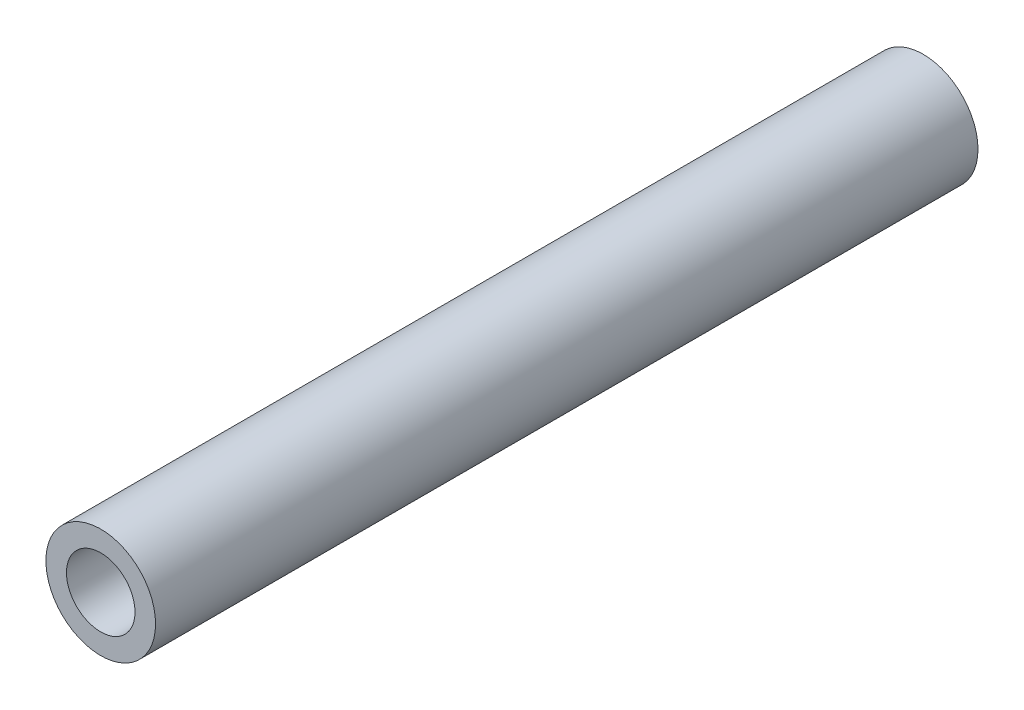
ISO-10303-21;
HEADER;
FILE_DESCRIPTION(('STEP AP214'),'2;1');
FILE_NAME('part.step','',(''),(''),'','','');
FILE_SCHEMA(('AUTOMOTIVE_DESIGN { 1 0 10303 214 1 1 1 1 }'));
ENDSEC;
DATA;
#1=APPLICATION_CONTEXT('core data for automotive mechanical design processes');
#2=APPLICATION_PROTOCOL_DEFINITION('international standard','automotive_design',2000,#1);
#3=PRODUCT_CONTEXT('',#1,'mechanical');
#4=PRODUCT('Part','Part','',(#3));
#5=PRODUCT_RELATED_PRODUCT_CATEGORY('part','',(#4));
#6=PRODUCT_DEFINITION_FORMATION('','',#4);
#7=PRODUCT_DEFINITION_CONTEXT('part definition',#1,'design');
#8=PRODUCT_DEFINITION('design','',#6,#7);
#9=PRODUCT_DEFINITION_SHAPE('','',#8);
#10=(LENGTH_UNIT() NAMED_UNIT(*) SI_UNIT(.MILLI.,.METRE.));
#11=(NAMED_UNIT(*) PLANE_ANGLE_UNIT() SI_UNIT($,.RADIAN.));
#12=(NAMED_UNIT(*) SI_UNIT($,.STERADIAN.) SOLID_ANGLE_UNIT());
#13=UNCERTAINTY_MEASURE_WITH_UNIT(LENGTH_MEASURE(1.E-05),#10,'distance_accuracy_value','');
#14=(GEOMETRIC_REPRESENTATION_CONTEXT(3) GLOBAL_UNCERTAINTY_ASSIGNED_CONTEXT((#13)) GLOBAL_UNIT_ASSIGNED_CONTEXT((#10,
#11,#12)) REPRESENTATION_CONTEXT('',''));
#15=CARTESIAN_POINT('',(0.,0.,0.));
#16=DIRECTION('',(0.,0.,1.));
#17=DIRECTION('',(1.,0.,0.));
#18=AXIS2_PLACEMENT_3D('',#15,#16,#17);
#19=CARTESIAN_POINT('',(0.,0.,60.));
#20=DIRECTION('',(0.,0.,1.));
#21=DIRECTION('',(1.,0.,0.));
#22=AXIS2_PLACEMENT_3D('',#19,#20,#21);
#23=PLANE('',#22);
#24=CARTESIAN_POINT('',(0.,0.,60.));
#25=DIRECTION('',(0.,0.,1.));
#26=DIRECTION('',(1.,0.,0.));
#27=AXIS2_PLACEMENT_3D('',#24,#25,#26);
#28=CIRCLE('',#27,4.);
#29=CARTESIAN_POINT('',(4.,0.,60.));
#30=VERTEX_POINT('',#29);
#31=EDGE_CURVE('E10',#30,#30,#28,.T.);
#32=ORIENTED_EDGE('',*,*,#31,.T.);
#33=EDGE_LOOP('',(#32));
#34=FACE_BOUND('',#33,.T.);
#35=CARTESIAN_POINT('',(0.,0.,60.));
#36=DIRECTION('',(0.,0.,1.));
#37=DIRECTION('',(1.,0.,0.));
#38=AXIS2_PLACEMENT_3D('',#35,#36,#37);
#39=CIRCLE('',#38,2.5);
#40=CARTESIAN_POINT('',(2.5,0.,60.));
#41=VERTEX_POINT('',#40);
#42=EDGE_CURVE('E46',#41,#41,#39,.T.);
#43=ORIENTED_EDGE('',*,*,#42,.F.);
#44=EDGE_LOOP('',(#43));
#45=FACE_BOUND('',#44,.T.);
#46=ADVANCED_FACE('F35',(#34,#45),#23,.T.);
#47=CARTESIAN_POINT('',(0.,0.,0.));
#48=DIRECTION('',(0.,0.,1.));
#49=DIRECTION('',(1.,0.,0.));
#50=AXIS2_PLACEMENT_3D('',#47,#48,#49);
#51=PLANE('',#50);
#52=CARTESIAN_POINT('',(0.,0.,0.));
#53=DIRECTION('',(0.,0.,1.));
#54=DIRECTION('',(1.,0.,0.));
#55=AXIS2_PLACEMENT_3D('',#52,#53,#54);
#56=CIRCLE('',#55,4.);
#57=CARTESIAN_POINT('',(4.,0.,0.));
#58=VERTEX_POINT('',#57);
#59=EDGE_CURVE('E39',#58,#58,#56,.T.);
#60=ORIENTED_EDGE('',*,*,#59,.F.);
#61=EDGE_LOOP('',(#60));
#62=FACE_BOUND('',#61,.T.);
#63=CARTESIAN_POINT('',(0.,0.,0.));
#64=DIRECTION('',(0.,0.,1.));
#65=DIRECTION('',(1.,0.,0.));
#66=AXIS2_PLACEMENT_3D('',#63,#64,#65);
#67=CIRCLE('',#66,2.5);
#68=CARTESIAN_POINT('',(2.5,0.,0.));
#69=VERTEX_POINT('',#68);
#70=EDGE_CURVE('E48',#69,#69,#67,.T.);
#71=ORIENTED_EDGE('',*,*,#70,.T.);
#72=EDGE_LOOP('',(#71));
#73=FACE_BOUND('',#72,.T.);
#74=ADVANCED_FACE('F58',(#62,#73),#51,.F.);
#75=CARTESIAN_POINT('',(0.,0.,60.));
#76=DIRECTION('',(0.,0.,-1.));
#77=DIRECTION('',(-1.,0.,0.));
#78=AXIS2_PLACEMENT_3D('',#75,#76,#77);
#79=CYLINDRICAL_SURFACE('',#78,4.);
#80=ORIENTED_EDGE('',*,*,#31,.F.);
#81=EDGE_LOOP('',(#80));
#82=FACE_BOUND('',#81,.T.);
#83=ORIENTED_EDGE('',*,*,#59,.T.);
#84=EDGE_LOOP('',(#83));
#85=FACE_BOUND('',#84,.T.);
#86=ADVANCED_FACE('F37',(#82,#85),#79,.T.);
#87=CARTESIAN_POINT('',(0.,0.,60.));
#88=DIRECTION('',(0.,0.,-1.));
#89=DIRECTION('',(-1.,0.,0.));
#90=AXIS2_PLACEMENT_3D('',#87,#88,#89);
#91=CYLINDRICAL_SURFACE('',#90,2.5);
#92=ORIENTED_EDGE('',*,*,#42,.T.);
#93=EDGE_LOOP('',(#92));
#94=FACE_BOUND('',#93,.T.);
#95=ORIENTED_EDGE('',*,*,#70,.F.);
#96=EDGE_LOOP('',(#95));
#97=FACE_BOUND('',#96,.T.);
#98=ADVANCED_FACE('F54',(#94,#97),#91,.F.);
#99=CLOSED_SHELL('',(#46,#74,#86,#98));
#100=MANIFOLD_SOLID_BREP('B2',#99);
#101=ADVANCED_BREP_SHAPE_REPRESENTATION('',(#18,#100),#14);
#102=SHAPE_DEFINITION_REPRESENTATION(#9,#101);
ENDSEC;
END-ISO-10303-21;
